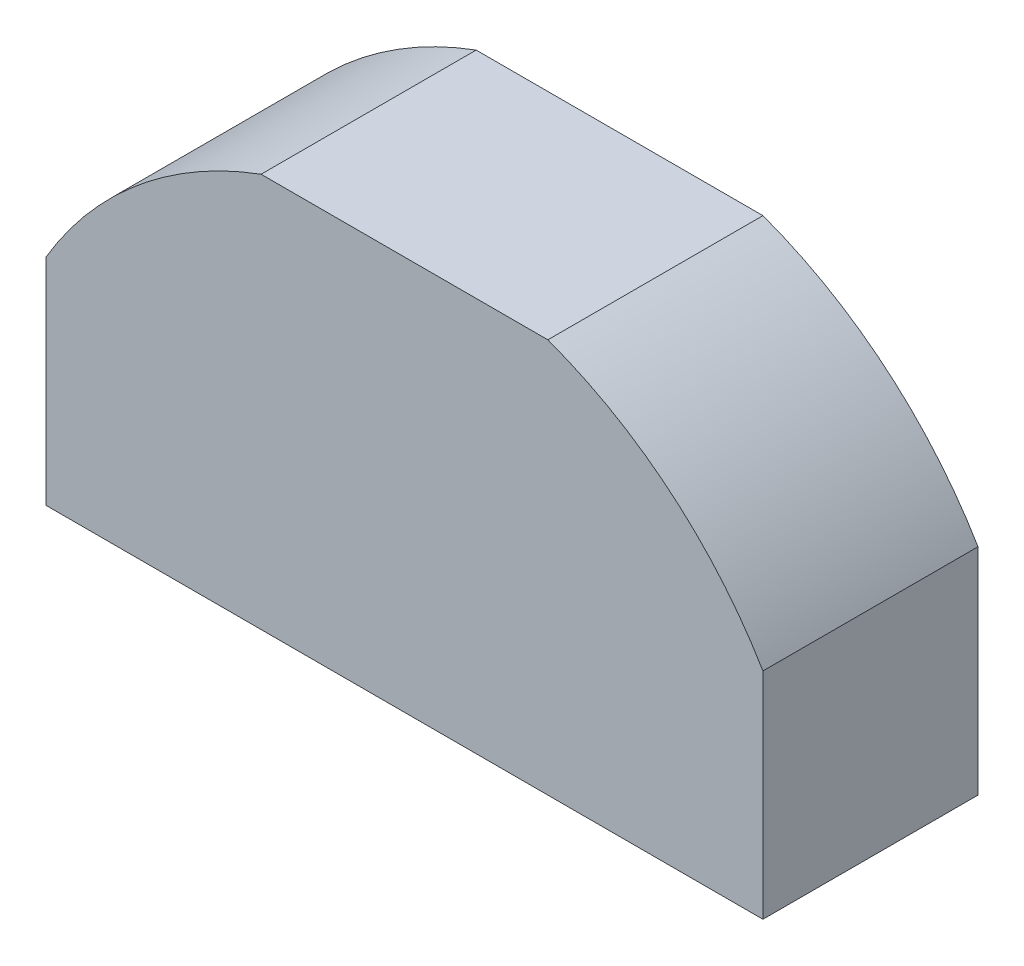
ISO-10303-21;
HEADER;
FILE_DESCRIPTION(('STEP AP214'),'2;1');
FILE_NAME('part.step','',(''),(''),'','','');
FILE_SCHEMA(('AUTOMOTIVE_DESIGN { 1 0 10303 214 1 1 1 1 }'));
ENDSEC;
DATA;
#1=APPLICATION_CONTEXT('core data for automotive mechanical design processes');
#2=APPLICATION_PROTOCOL_DEFINITION('international standard','automotive_design',2000,#1);
#3=PRODUCT_CONTEXT('',#1,'mechanical');
#4=PRODUCT('Part','Part','',(#3));
#5=PRODUCT_RELATED_PRODUCT_CATEGORY('part','',(#4));
#6=PRODUCT_DEFINITION_FORMATION('','',#4);
#7=PRODUCT_DEFINITION_CONTEXT('part definition',#1,'design');
#8=PRODUCT_DEFINITION('design','',#6,#7);
#9=PRODUCT_DEFINITION_SHAPE('','',#8);
#10=(LENGTH_UNIT() NAMED_UNIT(*) SI_UNIT(.MILLI.,.METRE.));
#11=(NAMED_UNIT(*) PLANE_ANGLE_UNIT() SI_UNIT($,.RADIAN.));
#12=(NAMED_UNIT(*) SI_UNIT($,.STERADIAN.) SOLID_ANGLE_UNIT());
#13=UNCERTAINTY_MEASURE_WITH_UNIT(LENGTH_MEASURE(1.E-05),#10,'distance_accuracy_value','');
#14=(GEOMETRIC_REPRESENTATION_CONTEXT(3) GLOBAL_UNCERTAINTY_ASSIGNED_CONTEXT((#13)) GLOBAL_UNIT_ASSIGNED_CONTEXT((#10,
#11,#12)) REPRESENTATION_CONTEXT('',''));
#15=CARTESIAN_POINT('',(0.,0.,0.));
#16=DIRECTION('',(0.,0.,1.));
#17=DIRECTION('',(1.,0.,0.));
#18=AXIS2_PLACEMENT_3D('',#15,#16,#17);
#19=CARTESIAN_POINT('',(-5.,0.,3.));
#20=DIRECTION('',(1.,0.,0.));
#21=DIRECTION('',(0.,1.,0.));
#22=AXIS2_PLACEMENT_3D('',#19,#20,#21);
#23=PLANE('',#22);
#24=DIRECTION('',(0.,-1.,0.));
#25=VECTOR('',#24,1.);
#26=CARTESIAN_POINT('',(-5.,0.,0.));
#27=LINE('',#26,#25);
#28=CARTESIAN_POINT('',(-5.,3.,0.));
#29=VERTEX_POINT('',#28);
#30=CARTESIAN_POINT('',(-5.,0.,0.));
#31=VERTEX_POINT('',#30);
#32=EDGE_CURVE('E142',#29,#31,#27,.T.);
#33=ORIENTED_EDGE('',*,*,#32,.T.);
#34=DIRECTION('',(0.,0.,-1.));
#35=VECTOR('',#34,1.);
#36=CARTESIAN_POINT('',(-5.,0.,3.));
#37=LINE('',#36,#35);
#38=CARTESIAN_POINT('',(-5.,0.,3.));
#39=VERTEX_POINT('',#38);
#40=EDGE_CURVE('E11',#39,#31,#37,.T.);
#41=ORIENTED_EDGE('',*,*,#40,.F.);
#42=DIRECTION('',(0.,-1.,0.));
#43=VECTOR('',#42,1.);
#44=CARTESIAN_POINT('',(-5.,0.,3.));
#45=LINE('',#44,#43);
#46=CARTESIAN_POINT('',(-5.,3.,3.));
#47=VERTEX_POINT('',#46);
#48=EDGE_CURVE('E158',#47,#39,#45,.T.);
#49=ORIENTED_EDGE('',*,*,#48,.F.);
#50=DIRECTION('',(0.,0.,-1.));
#51=VECTOR('',#50,1.);
#52=CARTESIAN_POINT('',(-5.,3.,3.));
#53=LINE('',#52,#51);
#54=EDGE_CURVE('E138',#47,#29,#53,.T.);
#55=ORIENTED_EDGE('',*,*,#54,.T.);
#56=EDGE_LOOP('',(#33,#41,#49,#55));
#57=FACE_BOUND('',#56,.T.);
#58=ADVANCED_FACE('F40',(#57),#23,.F.);
#59=CARTESIAN_POINT('',(5.,0.,3.));
#60=DIRECTION('',(0.,1.,0.));
#61=DIRECTION('',(-1.,0.,0.));
#62=AXIS2_PLACEMENT_3D('',#59,#60,#61);
#63=PLANE('',#62);
#64=DIRECTION('',(1.,0.,0.));
#65=VECTOR('',#64,1.);
#66=CARTESIAN_POINT('',(5.,0.,0.));
#67=LINE('',#66,#65);
#68=CARTESIAN_POINT('',(5.,0.,0.));
#69=VERTEX_POINT('',#68);
#70=EDGE_CURVE('E146',#31,#69,#67,.T.);
#71=ORIENTED_EDGE('',*,*,#70,.T.);
#72=DIRECTION('',(0.,0.,-1.));
#73=VECTOR('',#72,1.);
#74=CARTESIAN_POINT('',(5.,0.,3.));
#75=LINE('',#74,#73);
#76=CARTESIAN_POINT('',(5.,0.,3.));
#77=VERTEX_POINT('',#76);
#78=EDGE_CURVE('E49',#77,#69,#75,.T.);
#79=ORIENTED_EDGE('',*,*,#78,.F.);
#80=DIRECTION('',(1.,0.,0.));
#81=VECTOR('',#80,1.);
#82=CARTESIAN_POINT('',(5.,0.,3.));
#83=LINE('',#82,#81);
#84=EDGE_CURVE('E103',#39,#77,#83,.T.);
#85=ORIENTED_EDGE('',*,*,#84,.F.);
#86=ORIENTED_EDGE('',*,*,#40,.T.);
#87=EDGE_LOOP('',(#71,#79,#85,#86));
#88=FACE_BOUND('',#87,.T.);
#89=ADVANCED_FACE('F185',(#88),#63,.F.);
#90=CARTESIAN_POINT('',(5.,0.,3.));
#91=DIRECTION('',(-1.,0.,0.));
#92=DIRECTION('',(0.,-1.,0.));
#93=AXIS2_PLACEMENT_3D('',#90,#91,#92);
#94=PLANE('',#93);
#95=DIRECTION('',(0.,1.,0.));
#96=VECTOR('',#95,1.);
#97=CARTESIAN_POINT('',(5.,0.,0.));
#98=LINE('',#97,#96);
#99=CARTESIAN_POINT('',(5.,3.,0.));
#100=VERTEX_POINT('',#99);
#101=EDGE_CURVE('E149',#69,#100,#98,.T.);
#102=ORIENTED_EDGE('',*,*,#101,.T.);
#103=DIRECTION('',(0.,0.,-1.));
#104=VECTOR('',#103,1.);
#105=CARTESIAN_POINT('',(5.,3.,3.));
#106=LINE('',#105,#104);
#107=CARTESIAN_POINT('',(5.,3.,3.));
#108=VERTEX_POINT('',#107);
#109=EDGE_CURVE('E130',#108,#100,#106,.T.);
#110=ORIENTED_EDGE('',*,*,#109,.F.);
#111=DIRECTION('',(0.,1.,0.));
#112=VECTOR('',#111,1.);
#113=CARTESIAN_POINT('',(5.,0.,3.));
#114=LINE('',#113,#112);
#115=EDGE_CURVE('E119',#77,#108,#114,.T.);
#116=ORIENTED_EDGE('',*,*,#115,.F.);
#117=ORIENTED_EDGE('',*,*,#78,.T.);
#118=EDGE_LOOP('',(#102,#110,#116,#117));
#119=FACE_BOUND('',#118,.T.);
#120=ADVANCED_FACE('F167',(#119),#94,.F.);
#121=CARTESIAN_POINT('',(0.,0.049999999999998,3.));
#122=DIRECTION('',(0.,0.,-1.));
#123=DIRECTION('',(-1.,0.,0.));
#124=AXIS2_PLACEMENT_3D('',#121,#122,#123);
#125=CYLINDRICAL_SURFACE('',#124,5.80538543078752);
#126=CARTESIAN_POINT('',(0.,0.049999999999998,0.));
#127=DIRECTION('',(0.,0.,1.));
#128=DIRECTION('',(-1.,0.,0.));
#129=AXIS2_PLACEMENT_3D('',#126,#127,#128);
#130=CIRCLE('',#129,5.80538543078752);
#131=CARTESIAN_POINT('',(2.,5.5,0.));
#132=VERTEX_POINT('',#131);
#133=EDGE_CURVE('E128',#100,#132,#130,.T.);
#134=ORIENTED_EDGE('',*,*,#133,.T.);
#135=DIRECTION('',(0.,0.,-1.));
#136=VECTOR('',#135,1.);
#137=CARTESIAN_POINT('',(2.,5.5,3.));
#138=LINE('',#137,#136);
#139=CARTESIAN_POINT('',(2.,5.5,3.));
#140=VERTEX_POINT('',#139);
#141=EDGE_CURVE('E125',#140,#132,#138,.T.);
#142=ORIENTED_EDGE('',*,*,#141,.F.);
#143=CARTESIAN_POINT('',(0.,0.049999999999998,3.));
#144=DIRECTION('',(0.,0.,1.));
#145=DIRECTION('',(-1.,0.,0.));
#146=AXIS2_PLACEMENT_3D('',#143,#144,#145);
#147=CIRCLE('',#146,5.80538543078752);
#148=EDGE_CURVE('E113',#108,#140,#147,.T.);
#149=ORIENTED_EDGE('',*,*,#148,.F.);
#150=ORIENTED_EDGE('',*,*,#109,.T.);
#151=EDGE_LOOP('',(#134,#142,#149,#150));
#152=FACE_BOUND('',#151,.T.);
#153=ADVANCED_FACE('F126',(#152),#125,.T.);
#154=CARTESIAN_POINT('',(2.,5.5,3.));
#155=DIRECTION('',(0.,-1.,0.));
#156=DIRECTION('',(1.,0.,0.));
#157=AXIS2_PLACEMENT_3D('',#154,#155,#156);
#158=PLANE('',#157);
#159=DIRECTION('',(-1.,0.,0.));
#160=VECTOR('',#159,1.);
#161=CARTESIAN_POINT('',(2.,5.5,0.));
#162=LINE('',#161,#160);
#163=CARTESIAN_POINT('',(-2.,5.5,0.));
#164=VERTEX_POINT('',#163);
#165=EDGE_CURVE('E88',#132,#164,#162,.T.);
#166=ORIENTED_EDGE('',*,*,#165,.T.);
#167=DIRECTION('',(0.,0.,-1.));
#168=VECTOR('',#167,1.);
#169=CARTESIAN_POINT('',(-2.,5.5,3.));
#170=LINE('',#169,#168);
#171=CARTESIAN_POINT('',(-2.,5.5,3.));
#172=VERTEX_POINT('',#171);
#173=EDGE_CURVE('E131',#172,#164,#170,.T.);
#174=ORIENTED_EDGE('',*,*,#173,.F.);
#175=DIRECTION('',(-1.,0.,0.));
#176=VECTOR('',#175,1.);
#177=CARTESIAN_POINT('',(2.,5.5,3.));
#178=LINE('',#177,#176);
#179=EDGE_CURVE('E117',#140,#172,#178,.T.);
#180=ORIENTED_EDGE('',*,*,#179,.F.);
#181=ORIENTED_EDGE('',*,*,#141,.T.);
#182=EDGE_LOOP('',(#166,#174,#180,#181));
#183=FACE_BOUND('',#182,.T.);
#184=ADVANCED_FACE('F133',(#183),#158,.F.);
#185=CARTESIAN_POINT('',(0.,0.049999999999998,3.));
#186=DIRECTION('',(0.,0.,-1.));
#187=DIRECTION('',(-1.,0.,0.));
#188=AXIS2_PLACEMENT_3D('',#185,#186,#187);
#189=CYLINDRICAL_SURFACE('',#188,5.80538543078752);
#190=CARTESIAN_POINT('',(0.,0.049999999999998,0.));
#191=DIRECTION('',(0.,0.,1.));
#192=DIRECTION('',(1.,0.,0.));
#193=AXIS2_PLACEMENT_3D('',#190,#191,#192);
#194=CIRCLE('',#193,5.80538543078752);
#195=EDGE_CURVE('E95',#164,#29,#194,.T.);
#196=ORIENTED_EDGE('',*,*,#195,.T.);
#197=ORIENTED_EDGE('',*,*,#54,.F.);
#198=CARTESIAN_POINT('',(0.,0.049999999999998,3.));
#199=DIRECTION('',(0.,0.,1.));
#200=DIRECTION('',(1.,0.,0.));
#201=AXIS2_PLACEMENT_3D('',#198,#199,#200);
#202=CIRCLE('',#201,5.80538543078752);
#203=EDGE_CURVE('E60',#172,#47,#202,.T.);
#204=ORIENTED_EDGE('',*,*,#203,.F.);
#205=ORIENTED_EDGE('',*,*,#173,.T.);
#206=EDGE_LOOP('',(#196,#197,#204,#205));
#207=FACE_BOUND('',#206,.T.);
#208=ADVANCED_FACE('F174',(#207),#189,.T.);
#209=CARTESIAN_POINT('',(0.,0.049999999999998,3.));
#210=DIRECTION('',(0.,0.,1.));
#211=DIRECTION('',(1.,0.,0.));
#212=AXIS2_PLACEMENT_3D('',#209,#210,#211);
#213=PLANE('',#212);
#214=ORIENTED_EDGE('',*,*,#48,.T.);
#215=ORIENTED_EDGE('',*,*,#84,.T.);
#216=ORIENTED_EDGE('',*,*,#115,.T.);
#217=ORIENTED_EDGE('',*,*,#148,.T.);
#218=ORIENTED_EDGE('',*,*,#179,.T.);
#219=ORIENTED_EDGE('',*,*,#203,.T.);
#220=EDGE_LOOP('',(#214,#215,#216,#217,#218,#219));
#221=FACE_BOUND('',#220,.T.);
#222=ADVANCED_FACE('F115',(#221),#213,.T.);
#223=CARTESIAN_POINT('',(0.,0.049999999999998,0.));
#224=DIRECTION('',(0.,0.,1.));
#225=DIRECTION('',(1.,0.,0.));
#226=AXIS2_PLACEMENT_3D('',#223,#224,#225);
#227=PLANE('',#226);
#228=ORIENTED_EDGE('',*,*,#32,.F.);
#229=ORIENTED_EDGE('',*,*,#195,.F.);
#230=ORIENTED_EDGE('',*,*,#165,.F.);
#231=ORIENTED_EDGE('',*,*,#133,.F.);
#232=ORIENTED_EDGE('',*,*,#101,.F.);
#233=ORIENTED_EDGE('',*,*,#70,.F.);
#234=EDGE_LOOP('',(#228,#229,#230,#231,#232,#233));
#235=FACE_BOUND('',#234,.T.);
#236=ADVANCED_FACE('F170',(#235),#227,.F.);
#237=CLOSED_SHELL('',(#58,#89,#120,#153,#184,#208,#222,#236));
#238=MANIFOLD_SOLID_BREP('B2',#237);
#239=ADVANCED_BREP_SHAPE_REPRESENTATION('',(#18,#238),#14);
#240=SHAPE_DEFINITION_REPRESENTATION(#9,#239);
ENDSEC;
END-ISO-10303-21;
